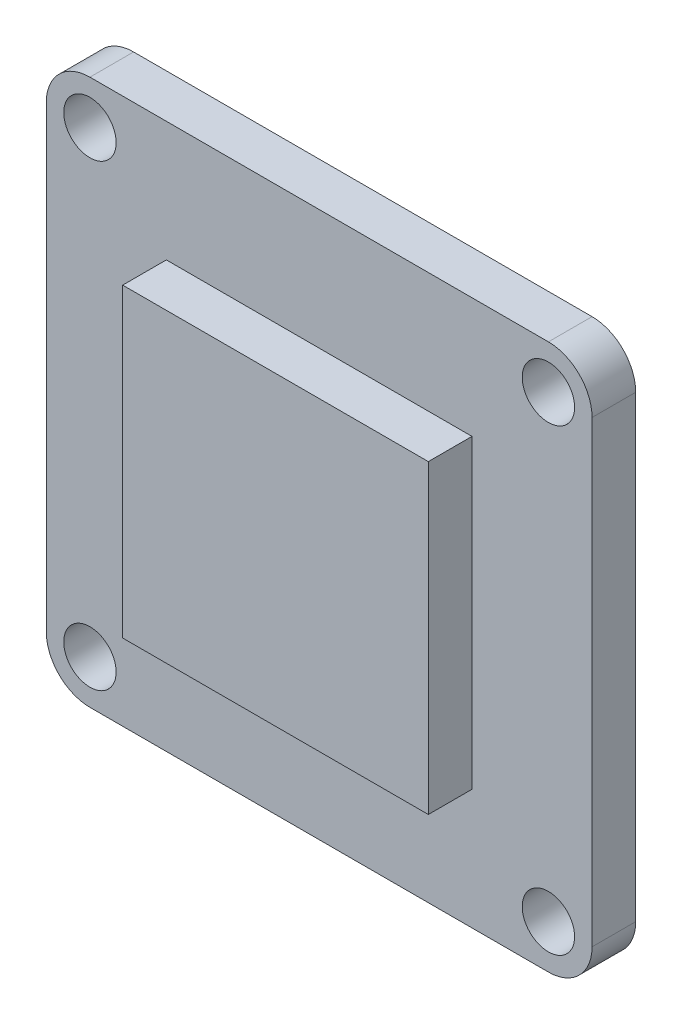
ISO-10303-21;
HEADER;
FILE_DESCRIPTION(('STEP AP214'),'2;1');
FILE_NAME('part.step','',(''),(''),'','','');
FILE_SCHEMA(('AUTOMOTIVE_DESIGN { 1 0 10303 214 1 1 1 1 }'));
ENDSEC;
DATA;
#1=APPLICATION_CONTEXT('core data for automotive mechanical design processes');
#2=APPLICATION_PROTOCOL_DEFINITION('international standard','automotive_design',2000,#1);
#3=PRODUCT_CONTEXT('',#1,'mechanical');
#4=PRODUCT('Part','Part','',(#3));
#5=PRODUCT_RELATED_PRODUCT_CATEGORY('part','',(#4));
#6=PRODUCT_DEFINITION_FORMATION('','',#4);
#7=PRODUCT_DEFINITION_CONTEXT('part definition',#1,'design');
#8=PRODUCT_DEFINITION('design','',#6,#7);
#9=PRODUCT_DEFINITION_SHAPE('','',#8);
#10=(LENGTH_UNIT() NAMED_UNIT(*) SI_UNIT(.MILLI.,.METRE.));
#11=(NAMED_UNIT(*) PLANE_ANGLE_UNIT() SI_UNIT($,.RADIAN.));
#12=(NAMED_UNIT(*) SI_UNIT($,.STERADIAN.) SOLID_ANGLE_UNIT());
#13=UNCERTAINTY_MEASURE_WITH_UNIT(LENGTH_MEASURE(1.E-05),#10,'distance_accuracy_value','');
#14=(GEOMETRIC_REPRESENTATION_CONTEXT(3) GLOBAL_UNCERTAINTY_ASSIGNED_CONTEXT((#13)) GLOBAL_UNIT_ASSIGNED_CONTEXT((#10,
#11,#12)) REPRESENTATION_CONTEXT('',''));
#15=CARTESIAN_POINT('',(0.,0.,0.));
#16=DIRECTION('',(0.,0.,1.));
#17=DIRECTION('',(1.,0.,0.));
#18=AXIS2_PLACEMENT_3D('',#15,#16,#17);
#19=CARTESIAN_POINT('',(79.0858711935382,-31.,2.));
#20=DIRECTION('',(0.,0.,-1.));
#21=DIRECTION('',(-1.,0.,0.));
#22=AXIS2_PLACEMENT_3D('',#19,#20,#21);
#23=PLANE('',#22);
#24=CARTESIAN_POINT('',(58.0858711935382,-31.,2.));
#25=DIRECTION('',(0.,0.,1.));
#26=DIRECTION('',(1.,0.,0.));
#27=AXIS2_PLACEMENT_3D('',#24,#25,#26);
#28=CIRCLE('',#27,1.2);
#29=CARTESIAN_POINT('',(59.2858711935382,-31.,2.));
#30=VERTEX_POINT('',#29);
#31=EDGE_CURVE('E145',#30,#30,#28,.T.);
#32=ORIENTED_EDGE('',*,*,#31,.F.);
#33=EDGE_LOOP('',(#32));
#34=FACE_BOUND('',#33,.T.);
#35=CARTESIAN_POINT('',(79.0858711935382,-31.,2.));
#36=DIRECTION('',(0.,0.,1.));
#37=DIRECTION('',(1.,0.,0.));
#38=AXIS2_PLACEMENT_3D('',#35,#36,#37);
#39=CIRCLE('',#38,1.2);
#40=CARTESIAN_POINT('',(80.2858711935382,-31.,2.));
#41=VERTEX_POINT('',#40);
#42=EDGE_CURVE('E154',#41,#41,#39,.T.);
#43=ORIENTED_EDGE('',*,*,#42,.F.);
#44=EDGE_LOOP('',(#43));
#45=FACE_BOUND('',#44,.T.);
#46=CARTESIAN_POINT('',(58.0858711935382,-52.,2.));
#47=DIRECTION('',(0.,0.,1.));
#48=DIRECTION('',(1.,0.,0.));
#49=AXIS2_PLACEMENT_3D('',#46,#47,#48);
#50=CIRCLE('',#49,1.2);
#51=CARTESIAN_POINT('',(59.2858711935382,-52.,2.));
#52=VERTEX_POINT('',#51);
#53=EDGE_CURVE('E160',#52,#52,#50,.T.);
#54=ORIENTED_EDGE('',*,*,#53,.F.);
#55=EDGE_LOOP('',(#54));
#56=FACE_BOUND('',#55,.T.);
#57=CARTESIAN_POINT('',(79.0858711935382,-52.,2.));
#58=DIRECTION('',(0.,0.,1.));
#59=DIRECTION('',(1.,0.,0.));
#60=AXIS2_PLACEMENT_3D('',#57,#58,#59);
#61=CIRCLE('',#60,1.2);
#62=CARTESIAN_POINT('',(80.2858711935382,-52.,2.));
#63=VERTEX_POINT('',#62);
#64=EDGE_CURVE('E166',#63,#63,#61,.T.);
#65=ORIENTED_EDGE('',*,*,#64,.F.);
#66=EDGE_LOOP('',(#65));
#67=FACE_BOUND('',#66,.T.);
#68=CARTESIAN_POINT('',(79.0858711935382,-31.,2.));
#69=DIRECTION('',(0.,0.,1.));
#70=DIRECTION('',(-1.,0.,0.));
#71=AXIS2_PLACEMENT_3D('',#68,#69,#70);
#72=CIRCLE('',#71,2.);
#73=CARTESIAN_POINT('',(81.0858711935382,-31.,2.));
#74=VERTEX_POINT('',#73);
#75=CARTESIAN_POINT('',(79.0858711935382,-29.,2.));
#76=VERTEX_POINT('',#75);
#77=EDGE_CURVE('E172',#74,#76,#72,.T.);
#78=ORIENTED_EDGE('',*,*,#77,.T.);
#79=DIRECTION('',(-1.,0.,0.));
#80=VECTOR('',#79,1.);
#81=CARTESIAN_POINT('',(58.0858711935382,-29.,2.));
#82=LINE('',#81,#80);
#83=CARTESIAN_POINT('',(58.0858711935382,-29.,2.));
#84=VERTEX_POINT('',#83);
#85=EDGE_CURVE('E175',#76,#84,#82,.T.);
#86=ORIENTED_EDGE('',*,*,#85,.T.);
#87=CARTESIAN_POINT('',(58.0858711935382,-31.,2.));
#88=DIRECTION('',(0.,0.,1.));
#89=DIRECTION('',(1.,0.,0.));
#90=AXIS2_PLACEMENT_3D('',#87,#88,#89);
#91=CIRCLE('',#90,2.);
#92=CARTESIAN_POINT('',(56.0858711935382,-31.,2.));
#93=VERTEX_POINT('',#92);
#94=EDGE_CURVE('E178',#84,#93,#91,.T.);
#95=ORIENTED_EDGE('',*,*,#94,.T.);
#96=DIRECTION('',(0.,-1.,0.));
#97=VECTOR('',#96,1.);
#98=CARTESIAN_POINT('',(56.0858711935382,-31.,2.));
#99=LINE('',#98,#97);
#100=CARTESIAN_POINT('',(56.0858711935382,-52.,2.));
#101=VERTEX_POINT('',#100);
#102=EDGE_CURVE('E180',#93,#101,#99,.T.);
#103=ORIENTED_EDGE('',*,*,#102,.T.);
#104=CARTESIAN_POINT('',(58.0858711935382,-52.,2.));
#105=DIRECTION('',(0.,0.,1.));
#106=DIRECTION('',(1.,0.,0.));
#107=AXIS2_PLACEMENT_3D('',#104,#105,#106);
#108=CIRCLE('',#107,2.);
#109=CARTESIAN_POINT('',(58.0858711935382,-54.,2.));
#110=VERTEX_POINT('',#109);
#111=EDGE_CURVE('E182',#101,#110,#108,.T.);
#112=ORIENTED_EDGE('',*,*,#111,.T.);
#113=DIRECTION('',(1.,0.,0.));
#114=VECTOR('',#113,1.);
#115=CARTESIAN_POINT('',(58.0858711935382,-54.,2.));
#116=LINE('',#115,#114);
#117=CARTESIAN_POINT('',(79.0858711935382,-54.,2.));
#118=VERTEX_POINT('',#117);
#119=EDGE_CURVE('E184',#110,#118,#116,.T.);
#120=ORIENTED_EDGE('',*,*,#119,.T.);
#121=CARTESIAN_POINT('',(79.0858711935382,-52.,2.));
#122=DIRECTION('',(0.,0.,1.));
#123=DIRECTION('',(1.,0.,0.));
#124=AXIS2_PLACEMENT_3D('',#121,#122,#123);
#125=CIRCLE('',#124,2.);
#126=CARTESIAN_POINT('',(81.0858711935382,-52.,2.));
#127=VERTEX_POINT('',#126);
#128=EDGE_CURVE('E186',#118,#127,#125,.T.);
#129=ORIENTED_EDGE('',*,*,#128,.T.);
#130=DIRECTION('',(0.,1.,0.));
#131=VECTOR('',#130,1.);
#132=CARTESIAN_POINT('',(81.0858711935382,-31.,2.));
#133=LINE('',#132,#131);
#134=EDGE_CURVE('E188',#127,#74,#133,.T.);
#135=ORIENTED_EDGE('',*,*,#134,.T.);
#136=EDGE_LOOP('',(#78,#86,#95,#103,#112,#120,#129,#135));
#137=FACE_BOUND('',#136,.T.);
#138=DIRECTION('',(0.,-1.,0.));
#139=VECTOR('',#138,1.);
#140=CARTESIAN_POINT('',(61.5858711935382,-34.5,2.));
#141=LINE('',#140,#139);
#142=CARTESIAN_POINT('',(61.5858711935382,-34.5,2.));
#143=VERTEX_POINT('',#142);
#144=CARTESIAN_POINT('',(61.5858711935382,-48.5,2.));
#145=VERTEX_POINT('',#144);
#146=EDGE_CURVE('E141',#143,#145,#141,.T.);
#147=ORIENTED_EDGE('',*,*,#146,.F.);
#148=DIRECTION('',(-1.,0.,0.));
#149=VECTOR('',#148,1.);
#150=CARTESIAN_POINT('',(61.5858711935382,-34.5,2.));
#151=LINE('',#150,#149);
#152=CARTESIAN_POINT('',(75.5858711935382,-34.5,2.));
#153=VERTEX_POINT('',#152);
#154=EDGE_CURVE('E138',#153,#143,#151,.T.);
#155=ORIENTED_EDGE('',*,*,#154,.F.);
#156=DIRECTION('',(0.,1.,0.));
#157=VECTOR('',#156,1.);
#158=CARTESIAN_POINT('',(75.5858711935382,-34.5,2.));
#159=LINE('',#158,#157);
#160=CARTESIAN_POINT('',(75.5858711935382,-48.5,2.));
#161=VERTEX_POINT('',#160);
#162=EDGE_CURVE('E52',#161,#153,#159,.T.);
#163=ORIENTED_EDGE('',*,*,#162,.F.);
#164=DIRECTION('',(1.,0.,0.));
#165=VECTOR('',#164,1.);
#166=CARTESIAN_POINT('',(61.5858711935382,-48.5,2.));
#167=LINE('',#166,#165);
#168=EDGE_CURVE('E47',#145,#161,#167,.T.);
#169=ORIENTED_EDGE('',*,*,#168,.F.);
#170=EDGE_LOOP('',(#147,#155,#163,#169));
#171=FACE_BOUND('',#170,.T.);
#172=ADVANCED_FACE('F32',(#34,#45,#56,#67,#137,#171),#23,.F.);
#173=CARTESIAN_POINT('',(79.0858711935382,-31.,0.));
#174=DIRECTION('',(0.,0.,-1.));
#175=DIRECTION('',(-1.,0.,0.));
#176=AXIS2_PLACEMENT_3D('',#173,#174,#175);
#177=PLANE('',#176);
#178=CARTESIAN_POINT('',(79.0858711935382,-31.,0.));
#179=DIRECTION('',(0.,0.,1.));
#180=DIRECTION('',(1.,0.,0.));
#181=AXIS2_PLACEMENT_3D('',#178,#179,#180);
#182=CIRCLE('',#181,1.2);
#183=CARTESIAN_POINT('',(80.2858711935382,-31.,0.));
#184=VERTEX_POINT('',#183);
#185=EDGE_CURVE('E152',#184,#184,#182,.T.);
#186=ORIENTED_EDGE('',*,*,#185,.T.);
#187=EDGE_LOOP('',(#186));
#188=FACE_BOUND('',#187,.T.);
#189=CARTESIAN_POINT('',(79.0858711935382,-52.,0.));
#190=DIRECTION('',(0.,0.,1.));
#191=DIRECTION('',(1.,0.,0.));
#192=AXIS2_PLACEMENT_3D('',#189,#190,#191);
#193=CIRCLE('',#192,1.2);
#194=CARTESIAN_POINT('',(80.2858711935382,-52.,0.));
#195=VERTEX_POINT('',#194);
#196=EDGE_CURVE('E163',#195,#195,#193,.T.);
#197=ORIENTED_EDGE('',*,*,#196,.T.);
#198=EDGE_LOOP('',(#197));
#199=FACE_BOUND('',#198,.T.);
#200=CARTESIAN_POINT('',(79.0858711935382,-31.,0.));
#201=DIRECTION('',(0.,0.,1.));
#202=DIRECTION('',(-1.,0.,0.));
#203=AXIS2_PLACEMENT_3D('',#200,#201,#202);
#204=CIRCLE('',#203,2.);
#205=CARTESIAN_POINT('',(81.0858711935382,-31.,0.));
#206=VERTEX_POINT('',#205);
#207=CARTESIAN_POINT('',(79.0858711935382,-29.,0.));
#208=VERTEX_POINT('',#207);
#209=EDGE_CURVE('E169',#206,#208,#204,.T.);
#210=ORIENTED_EDGE('',*,*,#209,.F.);
#211=DIRECTION('',(0.,1.,0.));
#212=VECTOR('',#211,1.);
#213=CARTESIAN_POINT('',(81.0858711935382,-31.,0.));
#214=LINE('',#213,#212);
#215=CARTESIAN_POINT('',(81.0858711935382,-52.,0.));
#216=VERTEX_POINT('',#215);
#217=EDGE_CURVE('E176',#216,#206,#214,.T.);
#218=ORIENTED_EDGE('',*,*,#217,.F.);
#219=CARTESIAN_POINT('',(79.0858711935382,-52.,0.));
#220=DIRECTION('',(0.,0.,1.));
#221=DIRECTION('',(1.,0.,0.));
#222=AXIS2_PLACEMENT_3D('',#219,#220,#221);
#223=CIRCLE('',#222,2.);
#224=CARTESIAN_POINT('',(79.0858711935382,-54.,0.));
#225=VERTEX_POINT('',#224);
#226=EDGE_CURVE('E203',#225,#216,#223,.T.);
#227=ORIENTED_EDGE('',*,*,#226,.F.);
#228=DIRECTION('',(1.,0.,0.));
#229=VECTOR('',#228,1.);
#230=CARTESIAN_POINT('',(58.0858711935382,-54.,0.));
#231=LINE('',#230,#229);
#232=CARTESIAN_POINT('',(58.0858711935382,-54.,0.));
#233=VERTEX_POINT('',#232);
#234=EDGE_CURVE('E201',#233,#225,#231,.T.);
#235=ORIENTED_EDGE('',*,*,#234,.F.);
#236=CARTESIAN_POINT('',(58.0858711935382,-52.,0.));
#237=DIRECTION('',(0.,0.,1.));
#238=DIRECTION('',(1.,0.,0.));
#239=AXIS2_PLACEMENT_3D('',#236,#237,#238);
#240=CIRCLE('',#239,2.);
#241=CARTESIAN_POINT('',(56.0858711935382,-52.,0.));
#242=VERTEX_POINT('',#241);
#243=EDGE_CURVE('E199',#242,#233,#240,.T.);
#244=ORIENTED_EDGE('',*,*,#243,.F.);
#245=DIRECTION('',(0.,-1.,0.));
#246=VECTOR('',#245,1.);
#247=CARTESIAN_POINT('',(56.0858711935382,-31.,0.));
#248=LINE('',#247,#246);
#249=CARTESIAN_POINT('',(56.0858711935382,-31.,0.));
#250=VERTEX_POINT('',#249);
#251=EDGE_CURVE('E197',#250,#242,#248,.T.);
#252=ORIENTED_EDGE('',*,*,#251,.F.);
#253=CARTESIAN_POINT('',(58.0858711935382,-31.,0.));
#254=DIRECTION('',(0.,0.,1.));
#255=DIRECTION('',(1.,0.,0.));
#256=AXIS2_PLACEMENT_3D('',#253,#254,#255);
#257=CIRCLE('',#256,2.);
#258=CARTESIAN_POINT('',(58.0858711935382,-29.,0.));
#259=VERTEX_POINT('',#258);
#260=EDGE_CURVE('E195',#259,#250,#257,.T.);
#261=ORIENTED_EDGE('',*,*,#260,.F.);
#262=DIRECTION('',(-1.,0.,0.));
#263=VECTOR('',#262,1.);
#264=CARTESIAN_POINT('',(58.0858711935382,-29.,0.));
#265=LINE('',#264,#263);
#266=EDGE_CURVE('E193',#208,#259,#265,.T.);
#267=ORIENTED_EDGE('',*,*,#266,.F.);
#268=EDGE_LOOP('',(#210,#218,#227,#235,#244,#252,#261,#267));
#269=FACE_BOUND('',#268,.T.);
#270=CARTESIAN_POINT('',(58.0858711935382,-52.,0.));
#271=DIRECTION('',(0.,0.,1.));
#272=DIRECTION('',(1.,0.,0.));
#273=AXIS2_PLACEMENT_3D('',#270,#271,#272);
#274=CIRCLE('',#273,1.2);
#275=CARTESIAN_POINT('',(59.2858711935382,-52.,0.));
#276=VERTEX_POINT('',#275);
#277=EDGE_CURVE('E157',#276,#276,#274,.T.);
#278=ORIENTED_EDGE('',*,*,#277,.T.);
#279=EDGE_LOOP('',(#278));
#280=FACE_BOUND('',#279,.T.);
#281=CARTESIAN_POINT('',(58.0858711935382,-31.,0.));
#282=DIRECTION('',(0.,0.,1.));
#283=DIRECTION('',(1.,0.,0.));
#284=AXIS2_PLACEMENT_3D('',#281,#282,#283);
#285=CIRCLE('',#284,1.2);
#286=CARTESIAN_POINT('',(59.2858711935382,-31.,0.));
#287=VERTEX_POINT('',#286);
#288=EDGE_CURVE('E142',#287,#287,#285,.T.);
#289=ORIENTED_EDGE('',*,*,#288,.T.);
#290=EDGE_LOOP('',(#289));
#291=FACE_BOUND('',#290,.T.);
#292=ADVANCED_FACE('F233',(#188,#199,#269,#280,#291),#177,.T.);
#293=CARTESIAN_POINT('',(79.0858711935382,-31.,2.));
#294=DIRECTION('',(0.,0.,-1.));
#295=DIRECTION('',(-1.,0.,0.));
#296=AXIS2_PLACEMENT_3D('',#293,#294,#295);
#297=CYLINDRICAL_SURFACE('',#296,2.);
#298=ORIENTED_EDGE('',*,*,#209,.T.);
#299=DIRECTION('',(0.,0.,-1.));
#300=VECTOR('',#299,1.);
#301=CARTESIAN_POINT('',(79.0858711935382,-29.,2.));
#302=LINE('',#301,#300);
#303=EDGE_CURVE('E11',#76,#208,#302,.T.);
#304=ORIENTED_EDGE('',*,*,#303,.F.);
#305=ORIENTED_EDGE('',*,*,#77,.F.);
#306=DIRECTION('',(0.,0.,-1.));
#307=VECTOR('',#306,1.);
#308=CARTESIAN_POINT('',(81.0858711935382,-31.,2.));
#309=LINE('',#308,#307);
#310=EDGE_CURVE('E190',#74,#206,#309,.T.);
#311=ORIENTED_EDGE('',*,*,#310,.T.);
#312=EDGE_LOOP('',(#298,#304,#305,#311));
#313=FACE_BOUND('',#312,.T.);
#314=ADVANCED_FACE('F34',(#313),#297,.T.);
#315=CARTESIAN_POINT('',(58.0858711935382,-29.,2.));
#316=DIRECTION('',(0.,-1.,0.));
#317=DIRECTION('',(0.,0.,-1.));
#318=AXIS2_PLACEMENT_3D('',#315,#316,#317);
#319=PLANE('',#318);
#320=ORIENTED_EDGE('',*,*,#266,.T.);
#321=DIRECTION('',(0.,0.,-1.));
#322=VECTOR('',#321,1.);
#323=CARTESIAN_POINT('',(58.0858711935382,-29.,2.));
#324=LINE('',#323,#322);
#325=EDGE_CURVE('E40',#84,#259,#324,.T.);
#326=ORIENTED_EDGE('',*,*,#325,.F.);
#327=ORIENTED_EDGE('',*,*,#85,.F.);
#328=ORIENTED_EDGE('',*,*,#303,.T.);
#329=EDGE_LOOP('',(#320,#326,#327,#328));
#330=FACE_BOUND('',#329,.T.);
#331=ADVANCED_FACE('F250',(#330),#319,.F.);
#332=CARTESIAN_POINT('',(58.0858711935382,-31.,2.));
#333=DIRECTION('',(0.,0.,-1.));
#334=DIRECTION('',(-1.,0.,0.));
#335=AXIS2_PLACEMENT_3D('',#332,#333,#334);
#336=CYLINDRICAL_SURFACE('',#335,2.);
#337=ORIENTED_EDGE('',*,*,#260,.T.);
#338=DIRECTION('',(0.,0.,-1.));
#339=VECTOR('',#338,1.);
#340=CARTESIAN_POINT('',(56.0858711935382,-31.,2.));
#341=LINE('',#340,#339);
#342=EDGE_CURVE('E220',#93,#250,#341,.T.);
#343=ORIENTED_EDGE('',*,*,#342,.F.);
#344=ORIENTED_EDGE('',*,*,#94,.F.);
#345=ORIENTED_EDGE('',*,*,#325,.T.);
#346=EDGE_LOOP('',(#337,#343,#344,#345));
#347=FACE_BOUND('',#346,.T.);
#348=ADVANCED_FACE('F227',(#347),#336,.T.);
#349=CARTESIAN_POINT('',(56.0858711935382,-31.,2.));
#350=DIRECTION('',(1.,0.,0.));
#351=DIRECTION('',(0.,0.,-1.));
#352=AXIS2_PLACEMENT_3D('',#349,#350,#351);
#353=PLANE('',#352);
#354=ORIENTED_EDGE('',*,*,#251,.T.);
#355=DIRECTION('',(0.,0.,-1.));
#356=VECTOR('',#355,1.);
#357=CARTESIAN_POINT('',(56.0858711935382,-52.,2.));
#358=LINE('',#357,#356);
#359=EDGE_CURVE('E217',#101,#242,#358,.T.);
#360=ORIENTED_EDGE('',*,*,#359,.F.);
#361=ORIENTED_EDGE('',*,*,#102,.F.);
#362=ORIENTED_EDGE('',*,*,#342,.T.);
#363=EDGE_LOOP('',(#354,#360,#361,#362));
#364=FACE_BOUND('',#363,.T.);
#365=ADVANCED_FACE('F239',(#364),#353,.F.);
#366=CARTESIAN_POINT('',(58.0858711935382,-52.,2.));
#367=DIRECTION('',(0.,0.,-1.));
#368=DIRECTION('',(-1.,0.,0.));
#369=AXIS2_PLACEMENT_3D('',#366,#367,#368);
#370=CYLINDRICAL_SURFACE('',#369,2.);
#371=ORIENTED_EDGE('',*,*,#243,.T.);
#372=DIRECTION('',(0.,0.,-1.));
#373=VECTOR('',#372,1.);
#374=CARTESIAN_POINT('',(58.0858711935382,-54.,2.));
#375=LINE('',#374,#373);
#376=EDGE_CURVE('E214',#110,#233,#375,.T.);
#377=ORIENTED_EDGE('',*,*,#376,.F.);
#378=ORIENTED_EDGE('',*,*,#111,.F.);
#379=ORIENTED_EDGE('',*,*,#359,.T.);
#380=EDGE_LOOP('',(#371,#377,#378,#379));
#381=FACE_BOUND('',#380,.T.);
#382=ADVANCED_FACE('F243',(#381),#370,.T.);
#383=CARTESIAN_POINT('',(58.0858711935382,-54.,2.));
#384=DIRECTION('',(0.,1.,0.));
#385=DIRECTION('',(0.,0.,1.));
#386=AXIS2_PLACEMENT_3D('',#383,#384,#385);
#387=PLANE('',#386);
#388=ORIENTED_EDGE('',*,*,#234,.T.);
#389=DIRECTION('',(0.,0.,-1.));
#390=VECTOR('',#389,1.);
#391=CARTESIAN_POINT('',(79.0858711935382,-54.,2.));
#392=LINE('',#391,#390);
#393=EDGE_CURVE('E211',#118,#225,#392,.T.);
#394=ORIENTED_EDGE('',*,*,#393,.F.);
#395=ORIENTED_EDGE('',*,*,#119,.F.);
#396=ORIENTED_EDGE('',*,*,#376,.T.);
#397=EDGE_LOOP('',(#388,#394,#395,#396));
#398=FACE_BOUND('',#397,.T.);
#399=ADVANCED_FACE('F263',(#398),#387,.F.);
#400=CARTESIAN_POINT('',(79.0858711935382,-52.,2.));
#401=DIRECTION('',(0.,0.,-1.));
#402=DIRECTION('',(-1.,0.,0.));
#403=AXIS2_PLACEMENT_3D('',#400,#401,#402);
#404=CYLINDRICAL_SURFACE('',#403,2.);
#405=ORIENTED_EDGE('',*,*,#226,.T.);
#406=DIRECTION('',(0.,0.,-1.));
#407=VECTOR('',#406,1.);
#408=CARTESIAN_POINT('',(81.0858711935382,-52.,2.));
#409=LINE('',#408,#407);
#410=EDGE_CURVE('E208',#127,#216,#409,.T.);
#411=ORIENTED_EDGE('',*,*,#410,.F.);
#412=ORIENTED_EDGE('',*,*,#128,.F.);
#413=ORIENTED_EDGE('',*,*,#393,.T.);
#414=EDGE_LOOP('',(#405,#411,#412,#413));
#415=FACE_BOUND('',#414,.T.);
#416=ADVANCED_FACE('F261',(#415),#404,.T.);
#417=CARTESIAN_POINT('',(81.0858711935382,-31.,2.));
#418=DIRECTION('',(-1.,0.,0.));
#419=DIRECTION('',(0.,0.,1.));
#420=AXIS2_PLACEMENT_3D('',#417,#418,#419);
#421=PLANE('',#420);
#422=ORIENTED_EDGE('',*,*,#217,.T.);
#423=ORIENTED_EDGE('',*,*,#310,.F.);
#424=ORIENTED_EDGE('',*,*,#134,.F.);
#425=ORIENTED_EDGE('',*,*,#410,.T.);
#426=EDGE_LOOP('',(#422,#423,#424,#425));
#427=FACE_BOUND('',#426,.T.);
#428=ADVANCED_FACE('F256',(#427),#421,.F.);
#429=CARTESIAN_POINT('',(79.0858711935382,-52.,2.));
#430=DIRECTION('',(0.,0.,-1.));
#431=DIRECTION('',(-1.,0.,0.));
#432=AXIS2_PLACEMENT_3D('',#429,#430,#431);
#433=CYLINDRICAL_SURFACE('',#432,1.2);
#434=ORIENTED_EDGE('',*,*,#64,.T.);
#435=EDGE_LOOP('',(#434));
#436=FACE_BOUND('',#435,.T.);
#437=ORIENTED_EDGE('',*,*,#196,.F.);
#438=EDGE_LOOP('',(#437));
#439=FACE_BOUND('',#438,.T.);
#440=ADVANCED_FACE('F283',(#436,#439),#433,.F.);
#441=CARTESIAN_POINT('',(58.0858711935382,-52.,2.));
#442=DIRECTION('',(0.,0.,-1.));
#443=DIRECTION('',(-1.,0.,0.));
#444=AXIS2_PLACEMENT_3D('',#441,#442,#443);
#445=CYLINDRICAL_SURFACE('',#444,1.2);
#446=ORIENTED_EDGE('',*,*,#53,.T.);
#447=EDGE_LOOP('',(#446));
#448=FACE_BOUND('',#447,.T.);
#449=ORIENTED_EDGE('',*,*,#277,.F.);
#450=EDGE_LOOP('',(#449));
#451=FACE_BOUND('',#450,.T.);
#452=ADVANCED_FACE('F290',(#448,#451),#445,.F.);
#453=CARTESIAN_POINT('',(79.0858711935382,-31.,2.));
#454=DIRECTION('',(0.,0.,-1.));
#455=DIRECTION('',(-1.,0.,0.));
#456=AXIS2_PLACEMENT_3D('',#453,#454,#455);
#457=CYLINDRICAL_SURFACE('',#456,1.2);
#458=ORIENTED_EDGE('',*,*,#42,.T.);
#459=EDGE_LOOP('',(#458));
#460=FACE_BOUND('',#459,.T.);
#461=ORIENTED_EDGE('',*,*,#185,.F.);
#462=EDGE_LOOP('',(#461));
#463=FACE_BOUND('',#462,.T.);
#464=ADVANCED_FACE('F295',(#460,#463),#457,.F.);
#465=CARTESIAN_POINT('',(58.0858711935382,-31.,2.));
#466=DIRECTION('',(0.,0.,-1.));
#467=DIRECTION('',(-1.,0.,0.));
#468=AXIS2_PLACEMENT_3D('',#465,#466,#467);
#469=CYLINDRICAL_SURFACE('',#468,1.2);
#470=ORIENTED_EDGE('',*,*,#31,.T.);
#471=EDGE_LOOP('',(#470));
#472=FACE_BOUND('',#471,.T.);
#473=ORIENTED_EDGE('',*,*,#288,.F.);
#474=EDGE_LOOP('',(#473));
#475=FACE_BOUND('',#474,.T.);
#476=ADVANCED_FACE('F305',(#472,#475),#469,.F.);
#477=CARTESIAN_POINT('',(61.5858711935382,-34.5,4.));
#478=DIRECTION('',(1.,0.,0.));
#479=DIRECTION('',(0.,0.,-1.));
#480=AXIS2_PLACEMENT_3D('',#477,#478,#479);
#481=PLANE('',#480);
#482=ORIENTED_EDGE('',*,*,#146,.T.);
#483=DIRECTION('',(0.,0.,-1.));
#484=VECTOR('',#483,1.);
#485=CARTESIAN_POINT('',(61.5858711935382,-48.5,4.));
#486=LINE('',#485,#484);
#487=CARTESIAN_POINT('',(61.5858711935382,-48.5,4.));
#488=VERTEX_POINT('',#487);
#489=EDGE_CURVE('E122',#488,#145,#486,.T.);
#490=ORIENTED_EDGE('',*,*,#489,.F.);
#491=DIRECTION('',(0.,-1.,0.));
#492=VECTOR('',#491,1.);
#493=CARTESIAN_POINT('',(61.5858711935382,-34.5,4.));
#494=LINE('',#493,#492);
#495=CARTESIAN_POINT('',(61.5858711935382,-34.5,4.));
#496=VERTEX_POINT('',#495);
#497=EDGE_CURVE('E129',#496,#488,#494,.T.);
#498=ORIENTED_EDGE('',*,*,#497,.F.);
#499=DIRECTION('',(0.,0.,-1.));
#500=VECTOR('',#499,1.);
#501=CARTESIAN_POINT('',(61.5858711935382,-34.5,4.));
#502=LINE('',#501,#500);
#503=EDGE_CURVE('E438',#496,#143,#502,.T.);
#504=ORIENTED_EDGE('',*,*,#503,.T.);
#505=EDGE_LOOP('',(#482,#490,#498,#504));
#506=FACE_BOUND('',#505,.T.);
#507=ADVANCED_FACE('F140',(#506),#481,.F.);
#508=CARTESIAN_POINT('',(61.5858711935382,-48.5,4.));
#509=DIRECTION('',(0.,1.,0.));
#510=DIRECTION('',(0.,0.,1.));
#511=AXIS2_PLACEMENT_3D('',#508,#509,#510);
#512=PLANE('',#511);
#513=ORIENTED_EDGE('',*,*,#168,.T.);
#514=DIRECTION('',(0.,0.,-1.));
#515=VECTOR('',#514,1.);
#516=CARTESIAN_POINT('',(75.5858711935382,-48.5,4.));
#517=LINE('',#516,#515);
#518=CARTESIAN_POINT('',(75.5858711935382,-48.5,4.));
#519=VERTEX_POINT('',#518);
#520=EDGE_CURVE('E125',#519,#161,#517,.T.);
#521=ORIENTED_EDGE('',*,*,#520,.F.);
#522=DIRECTION('',(1.,0.,0.));
#523=VECTOR('',#522,1.);
#524=CARTESIAN_POINT('',(61.5858711935382,-48.5,4.));
#525=LINE('',#524,#523);
#526=EDGE_CURVE('E118',#488,#519,#525,.T.);
#527=ORIENTED_EDGE('',*,*,#526,.F.);
#528=ORIENTED_EDGE('',*,*,#489,.T.);
#529=EDGE_LOOP('',(#513,#521,#527,#528));
#530=FACE_BOUND('',#529,.T.);
#531=ADVANCED_FACE('F120',(#530),#512,.F.);
#532=CARTESIAN_POINT('',(75.5858711935382,-34.5,4.));
#533=DIRECTION('',(-1.,0.,0.));
#534=DIRECTION('',(0.,0.,1.));
#535=AXIS2_PLACEMENT_3D('',#532,#533,#534);
#536=PLANE('',#535);
#537=ORIENTED_EDGE('',*,*,#162,.T.);
#538=DIRECTION('',(0.,0.,-1.));
#539=VECTOR('',#538,1.);
#540=CARTESIAN_POINT('',(75.5858711935382,-34.5,4.));
#541=LINE('',#540,#539);
#542=CARTESIAN_POINT('',(75.5858711935382,-34.5,4.));
#543=VERTEX_POINT('',#542);
#544=EDGE_CURVE('E147',#543,#153,#541,.T.);
#545=ORIENTED_EDGE('',*,*,#544,.F.);
#546=DIRECTION('',(0.,1.,0.));
#547=VECTOR('',#546,1.);
#548=CARTESIAN_POINT('',(75.5858711935382,-34.5,4.));
#549=LINE('',#548,#547);
#550=EDGE_CURVE('E128',#519,#543,#549,.T.);
#551=ORIENTED_EDGE('',*,*,#550,.F.);
#552=ORIENTED_EDGE('',*,*,#520,.T.);
#553=EDGE_LOOP('',(#537,#545,#551,#552));
#554=FACE_BOUND('',#553,.T.);
#555=ADVANCED_FACE('F317',(#554),#536,.F.);
#556=CARTESIAN_POINT('',(61.5858711935382,-34.5,4.));
#557=DIRECTION('',(0.,-1.,0.));
#558=DIRECTION('',(0.,0.,-1.));
#559=AXIS2_PLACEMENT_3D('',#556,#557,#558);
#560=PLANE('',#559);
#561=ORIENTED_EDGE('',*,*,#154,.T.);
#562=ORIENTED_EDGE('',*,*,#503,.F.);
#563=DIRECTION('',(-1.,0.,0.));
#564=VECTOR('',#563,1.);
#565=CARTESIAN_POINT('',(61.5858711935382,-34.5,4.));
#566=LINE('',#565,#564);
#567=EDGE_CURVE('E134',#543,#496,#566,.T.);
#568=ORIENTED_EDGE('',*,*,#567,.F.);
#569=ORIENTED_EDGE('',*,*,#544,.T.);
#570=EDGE_LOOP('',(#561,#562,#568,#569));
#571=FACE_BOUND('',#570,.T.);
#572=ADVANCED_FACE('F320',(#571),#560,.F.);
#573=CARTESIAN_POINT('',(0.,0.,4.));
#574=DIRECTION('',(0.,0.,1.));
#575=DIRECTION('',(1.,0.,0.));
#576=AXIS2_PLACEMENT_3D('',#573,#574,#575);
#577=PLANE('',#576);
#578=ORIENTED_EDGE('',*,*,#497,.T.);
#579=ORIENTED_EDGE('',*,*,#526,.T.);
#580=ORIENTED_EDGE('',*,*,#550,.T.);
#581=ORIENTED_EDGE('',*,*,#567,.T.);
#582=EDGE_LOOP('',(#578,#579,#580,#581));
#583=FACE_BOUND('',#582,.T.);
#584=ADVANCED_FACE('F132',(#583),#577,.T.);
#585=CLOSED_SHELL('',(#172,#292,#314,#331,#348,#365,#382,#399,#416,#428,#440,#452,#464,#476,
#507,#531,#555,#572,#584));
#586=MANIFOLD_SOLID_BREP('B2',#585);
#587=ADVANCED_BREP_SHAPE_REPRESENTATION('',(#18,#586),#14);
#588=SHAPE_DEFINITION_REPRESENTATION(#9,#587);
ENDSEC;
END-ISO-10303-21;
